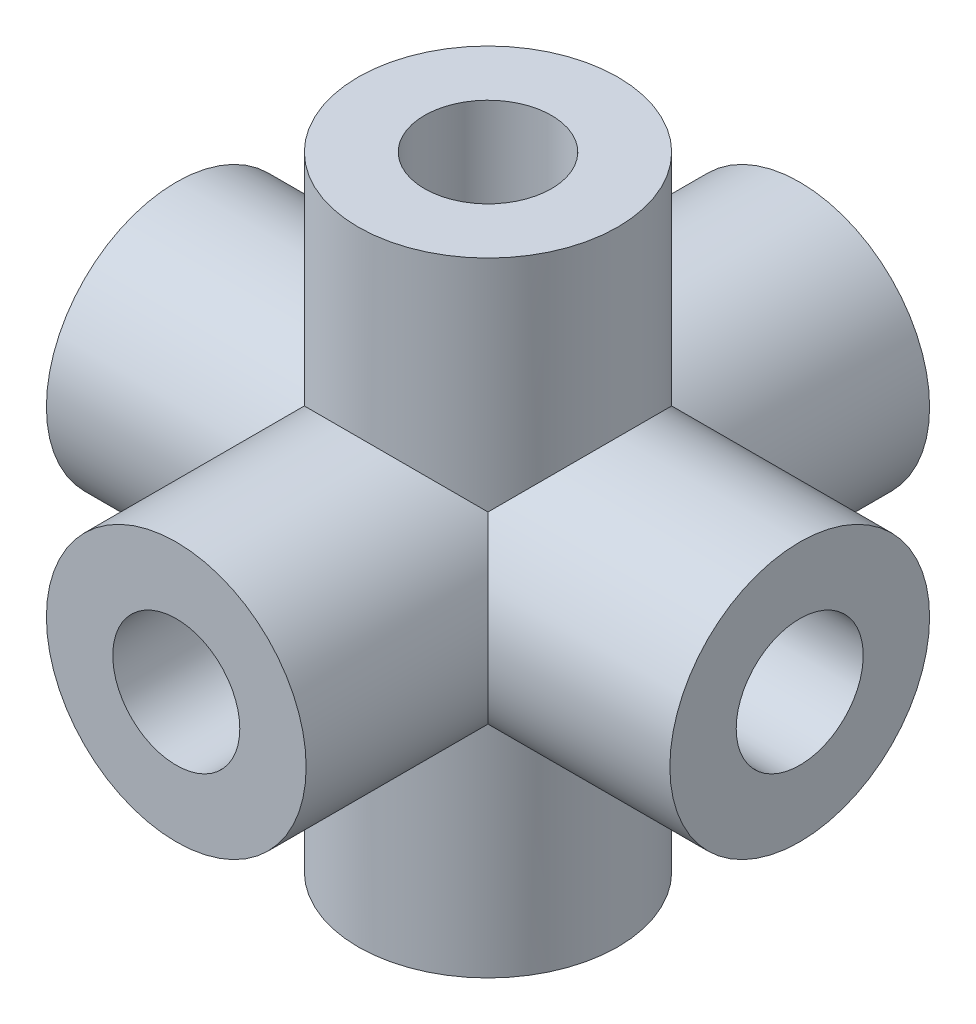
ISO-10303-21;
HEADER;
FILE_DESCRIPTION(('STEP AP214'),'2;1');
FILE_NAME('part.step','',(''),(''),'','','');
FILE_SCHEMA(('AUTOMOTIVE_DESIGN { 1 0 10303 214 1 1 1 1 }'));
ENDSEC;
DATA;
#1=APPLICATION_CONTEXT('core data for automotive mechanical design processes');
#2=APPLICATION_PROTOCOL_DEFINITION('international standard','automotive_design',2000,#1);
#3=PRODUCT_CONTEXT('',#1,'mechanical');
#4=PRODUCT('Part','Part','',(#3));
#5=PRODUCT_RELATED_PRODUCT_CATEGORY('part','',(#4));
#6=PRODUCT_DEFINITION_FORMATION('','',#4);
#7=PRODUCT_DEFINITION_CONTEXT('part definition',#1,'design');
#8=PRODUCT_DEFINITION('design','',#6,#7);
#9=PRODUCT_DEFINITION_SHAPE('','',#8);
#10=(LENGTH_UNIT() NAMED_UNIT(*) SI_UNIT(.MILLI.,.METRE.));
#11=(NAMED_UNIT(*) PLANE_ANGLE_UNIT() SI_UNIT($,.RADIAN.));
#12=(NAMED_UNIT(*) SI_UNIT($,.STERADIAN.) SOLID_ANGLE_UNIT());
#13=UNCERTAINTY_MEASURE_WITH_UNIT(LENGTH_MEASURE(1.E-05),#10,'distance_accuracy_value','');
#14=(GEOMETRIC_REPRESENTATION_CONTEXT(3) GLOBAL_UNCERTAINTY_ASSIGNED_CONTEXT((#13)) GLOBAL_UNIT_ASSIGNED_CONTEXT((#10,
#11,#12)) REPRESENTATION_CONTEXT('',''));
#15=CARTESIAN_POINT('',(0.,0.,0.));
#16=DIRECTION('',(0.,0.,1.));
#17=DIRECTION('',(1.,0.,0.));
#18=AXIS2_PLACEMENT_3D('',#15,#16,#17);
#19=CARTESIAN_POINT('',(0.,-12.,0.));
#20=DIRECTION('',(0.,1.,0.));
#21=DIRECTION('',(0.,0.,1.));
#22=AXIS2_PLACEMENT_3D('',#19,#20,#21);
#23=PLANE('',#22);
#24=CARTESIAN_POINT('',(0.,-12.,0.));
#25=DIRECTION('',(0.,1.,0.));
#26=DIRECTION('',(0.,0.,1.));
#27=AXIS2_PLACEMENT_3D('',#24,#25,#26);
#28=CIRCLE('',#27,5.);
#29=CARTESIAN_POINT('',(0.,-12.,5.));
#30=VERTEX_POINT('',#29);
#31=EDGE_CURVE('E101',#30,#30,#28,.T.);
#32=ORIENTED_EDGE('',*,*,#31,.F.);
#33=EDGE_LOOP('',(#32));
#34=FACE_BOUND('',#33,.T.);
#35=CARTESIAN_POINT('',(0.,-12.,0.));
#36=DIRECTION('',(0.,1.,0.));
#37=DIRECTION('',(0.,0.,1.));
#38=AXIS2_PLACEMENT_3D('',#35,#36,#37);
#39=CIRCLE('',#38,2.445);
#40=CARTESIAN_POINT('',(0.,-12.,2.445));
#41=VERTEX_POINT('',#40);
#42=EDGE_CURVE('E151',#41,#41,#39,.T.);
#43=ORIENTED_EDGE('',*,*,#42,.T.);
#44=EDGE_LOOP('',(#43));
#45=FACE_BOUND('',#44,.T.);
#46=ADVANCED_FACE('F32',(#34,#45),#23,.F.);
#47=CARTESIAN_POINT('',(0.,0.,-12.));
#48=DIRECTION('',(0.,0.,1.));
#49=DIRECTION('',(1.,0.,0.));
#50=AXIS2_PLACEMENT_3D('',#47,#48,#49);
#51=PLANE('',#50);
#52=CARTESIAN_POINT('',(0.,0.,-12.));
#53=DIRECTION('',(0.,0.,1.));
#54=DIRECTION('',(1.,0.,0.));
#55=AXIS2_PLACEMENT_3D('',#52,#53,#54);
#56=CIRCLE('',#55,5.);
#57=CARTESIAN_POINT('',(5.,0.,-12.));
#58=VERTEX_POINT('',#57);
#59=EDGE_CURVE('E95',#58,#58,#56,.T.);
#60=ORIENTED_EDGE('',*,*,#59,.F.);
#61=EDGE_LOOP('',(#60));
#62=FACE_BOUND('',#61,.T.);
#63=CARTESIAN_POINT('',(0.,0.,-12.));
#64=DIRECTION('',(0.,0.,1.));
#65=DIRECTION('',(1.,0.,0.));
#66=AXIS2_PLACEMENT_3D('',#63,#64,#65);
#67=CIRCLE('',#66,2.445);
#68=CARTESIAN_POINT('',(2.445,0.,-12.));
#69=VERTEX_POINT('',#68);
#70=EDGE_CURVE('E139',#69,#69,#67,.T.);
#71=ORIENTED_EDGE('',*,*,#70,.T.);
#72=EDGE_LOOP('',(#71));
#73=FACE_BOUND('',#72,.T.);
#74=ADVANCED_FACE('F169',(#62,#73),#51,.F.);
#75=CARTESIAN_POINT('',(12.,0.,0.));
#76=DIRECTION('',(1.,0.,0.));
#77=DIRECTION('',(0.,0.,-1.));
#78=AXIS2_PLACEMENT_3D('',#75,#76,#77);
#79=PLANE('',#78);
#80=CARTESIAN_POINT('',(12.,0.,0.));
#81=DIRECTION('',(1.,0.,0.));
#82=DIRECTION('',(0.,0.,-1.));
#83=AXIS2_PLACEMENT_3D('',#80,#81,#82);
#84=CIRCLE('',#83,5.);
#85=CARTESIAN_POINT('',(12.,0.,-5.));
#86=VERTEX_POINT('',#85);
#87=EDGE_CURVE('E114',#86,#86,#84,.T.);
#88=ORIENTED_EDGE('',*,*,#87,.T.);
#89=EDGE_LOOP('',(#88));
#90=FACE_BOUND('',#89,.T.);
#91=CARTESIAN_POINT('',(12.,0.,0.));
#92=DIRECTION('',(-1.,0.,0.));
#93=DIRECTION('',(0.,0.,1.));
#94=AXIS2_PLACEMENT_3D('',#91,#92,#93);
#95=CIRCLE('',#94,2.445);
#96=CARTESIAN_POINT('',(12.,0.,2.445));
#97=VERTEX_POINT('',#96);
#98=EDGE_CURVE('E127',#97,#97,#95,.T.);
#99=ORIENTED_EDGE('',*,*,#98,.T.);
#100=EDGE_LOOP('',(#99));
#101=FACE_BOUND('',#100,.T.);
#102=ADVANCED_FACE('F175',(#90,#101),#79,.T.);
#103=CARTESIAN_POINT('',(0.,0.,12.));
#104=DIRECTION('',(0.,0.,-1.));
#105=DIRECTION('',(-1.,0.,0.));
#106=AXIS2_PLACEMENT_3D('',#103,#104,#105);
#107=CYLINDRICAL_SURFACE('',#106,5.);
#108=CARTESIAN_POINT('',(0.,0.,12.));
#109=DIRECTION('',(0.,0.,1.));
#110=DIRECTION('',(1.,0.,0.));
#111=AXIS2_PLACEMENT_3D('',#108,#109,#110);
#112=CIRCLE('',#111,5.);
#113=CARTESIAN_POINT('',(5.,0.,12.));
#114=VERTEX_POINT('',#113);
#115=EDGE_CURVE('E94',#114,#114,#112,.T.);
#116=ORIENTED_EDGE('',*,*,#115,.F.);
#117=EDGE_LOOP('',(#116));
#118=FACE_BOUND('',#117,.T.);
#119=CARTESIAN_POINT('',(0.,0.,0.));
#120=DIRECTION('',(-0.707106781186547,0.,-0.707106781186547));
#121=DIRECTION('',(0.707106781186547,0.,-0.707106781186547));
#122=AXIS2_PLACEMENT_3D('',#119,#120,#121);
#123=ELLIPSE('',#122,7.07106781186547,5.);
#124=CARTESIAN_POINT('',(-3.53553390593274,-3.53553390593274,3.53553390593274));
#125=VERTEX_POINT('',#124);
#126=CARTESIAN_POINT('',(-3.53553390593274,3.53553390593274,3.53553390593274));
#127=VERTEX_POINT('',#126);
#128=EDGE_CURVE('E47',#125,#127,#123,.T.);
#129=ORIENTED_EDGE('',*,*,#128,.F.);
#130=CARTESIAN_POINT('',(0.,0.,0.));
#131=DIRECTION('',(0.,-0.707106781186547,-0.707106781186547));
#132=DIRECTION('',(0.,0.707106781186547,-0.707106781186547));
#133=AXIS2_PLACEMENT_3D('',#130,#131,#132);
#134=ELLIPSE('',#133,7.07106781186547,5.);
#135=CARTESIAN_POINT('',(3.53553390593274,-3.53553390593274,3.53553390593274));
#136=VERTEX_POINT('',#135);
#137=EDGE_CURVE('E78',#136,#125,#134,.T.);
#138=ORIENTED_EDGE('',*,*,#137,.F.);
#139=CARTESIAN_POINT('',(0.,0.,0.));
#140=DIRECTION('',(0.707106781186547,0.,-0.707106781186547));
#141=DIRECTION('',(-0.707106781186547,0.,-0.707106781186547));
#142=AXIS2_PLACEMENT_3D('',#139,#140,#141);
#143=ELLIPSE('',#142,7.07106781186547,5.);
#144=CARTESIAN_POINT('',(3.53553390593274,3.53553390593274,3.53553390593274));
#145=VERTEX_POINT('',#144);
#146=EDGE_CURVE('E82',#145,#136,#143,.T.);
#147=ORIENTED_EDGE('',*,*,#146,.F.);
#148=CARTESIAN_POINT('',(0.,0.,0.));
#149=DIRECTION('',(0.,0.707106781186547,-0.707106781186547));
#150=DIRECTION('',(0.,-0.707106781186547,-0.707106781186547));
#151=AXIS2_PLACEMENT_3D('',#148,#149,#150);
#152=ELLIPSE('',#151,7.07106781186547,5.);
#153=EDGE_CURVE('E73',#127,#145,#152,.T.);
#154=ORIENTED_EDGE('',*,*,#153,.F.);
#155=EDGE_LOOP('',(#129,#138,#147,#154));
#156=FACE_BOUND('',#155,.T.);
#157=ADVANCED_FACE('F34',(#118,#156),#107,.T.);
#158=CARTESIAN_POINT('',(0.,12.,0.));
#159=DIRECTION('',(0.,-1.,0.));
#160=DIRECTION('',(0.,0.,-1.));
#161=AXIS2_PLACEMENT_3D('',#158,#159,#160);
#162=CYLINDRICAL_SURFACE('',#161,5.);
#163=ORIENTED_EDGE('',*,*,#31,.T.);
#164=EDGE_LOOP('',(#163));
#165=FACE_BOUND('',#164,.T.);
#166=CARTESIAN_POINT('',(0.,0.,0.));
#167=DIRECTION('',(-0.707106781186547,-0.707106781186547,0.));
#168=DIRECTION('',(0.707106781186547,-0.707106781186547,0.));
#169=AXIS2_PLACEMENT_3D('',#166,#167,#168);
#170=ELLIPSE('',#169,7.07106781186547,5.);
#171=CARTESIAN_POINT('',(3.53553390593274,-3.53553390593274,-3.53553390593274));
#172=VERTEX_POINT('',#171);
#173=EDGE_CURVE('E54',#136,#172,#170,.F.);
#174=ORIENTED_EDGE('',*,*,#173,.F.);
#175=ORIENTED_EDGE('',*,*,#137,.T.);
#176=CARTESIAN_POINT('',(0.,0.,0.));
#177=DIRECTION('',(0.707106781186547,-0.707106781186547,0.));
#178=DIRECTION('',(-0.707106781186547,-0.707106781186547,0.));
#179=AXIS2_PLACEMENT_3D('',#176,#177,#178);
#180=ELLIPSE('',#179,7.07106781186547,5.);
#181=CARTESIAN_POINT('',(-3.53553390593274,-3.53553390593274,-3.53553390593274));
#182=VERTEX_POINT('',#181);
#183=EDGE_CURVE('E107',#182,#125,#180,.F.);
#184=ORIENTED_EDGE('',*,*,#183,.F.);
#185=CARTESIAN_POINT('',(0.,0.,0.));
#186=DIRECTION('',(0.,0.707106781186547,-0.707106781186547));
#187=DIRECTION('',(0.,-0.707106781186547,-0.707106781186547));
#188=AXIS2_PLACEMENT_3D('',#185,#186,#187);
#189=ELLIPSE('',#188,7.07106781186547,5.);
#190=EDGE_CURVE('E79',#182,#172,#189,.F.);
#191=ORIENTED_EDGE('',*,*,#190,.T.);
#192=EDGE_LOOP('',(#174,#175,#184,#191));
#193=FACE_BOUND('',#192,.T.);
#194=ADVANCED_FACE('F183',(#165,#193),#162,.T.);
#195=ORIENTED_EDGE('',*,*,#59,.T.);
#196=EDGE_LOOP('',(#195));
#197=FACE_BOUND('',#196,.T.);
#198=CARTESIAN_POINT('',(0.,0.,0.));
#199=DIRECTION('',(-0.707106781186547,0.,-0.707106781186547));
#200=DIRECTION('',(0.707106781186547,0.,-0.707106781186547));
#201=AXIS2_PLACEMENT_3D('',#198,#199,#200);
#202=ELLIPSE('',#201,7.07106781186547,5.);
#203=CARTESIAN_POINT('',(3.53553390593274,3.53553390593274,-3.53553390593274));
#204=VERTEX_POINT('',#203);
#205=EDGE_CURVE('E88',#172,#204,#202,.F.);
#206=ORIENTED_EDGE('',*,*,#205,.F.);
#207=ORIENTED_EDGE('',*,*,#190,.F.);
#208=CARTESIAN_POINT('',(0.,0.,0.));
#209=DIRECTION('',(0.707106781186547,0.,-0.707106781186547));
#210=DIRECTION('',(-0.707106781186547,0.,-0.707106781186547));
#211=AXIS2_PLACEMENT_3D('',#208,#209,#210);
#212=ELLIPSE('',#211,7.07106781186547,5.);
#213=CARTESIAN_POINT('',(-3.53553390593274,3.53553390593274,-3.53553390593274));
#214=VERTEX_POINT('',#213);
#215=EDGE_CURVE('E84',#214,#182,#212,.F.);
#216=ORIENTED_EDGE('',*,*,#215,.F.);
#217=CARTESIAN_POINT('',(0.,0.,0.));
#218=DIRECTION('',(0.,-0.707106781186547,-0.707106781186547));
#219=DIRECTION('',(0.,0.707106781186547,-0.707106781186547));
#220=AXIS2_PLACEMENT_3D('',#217,#218,#219);
#221=ELLIPSE('',#220,7.07106781186547,5.);
#222=EDGE_CURVE('E89',#204,#214,#221,.F.);
#223=ORIENTED_EDGE('',*,*,#222,.F.);
#224=EDGE_LOOP('',(#206,#207,#216,#223));
#225=FACE_BOUND('',#224,.T.);
#226=ADVANCED_FACE('F186',(#197,#225),#107,.T.);
#227=CARTESIAN_POINT('',(0.,12.,0.));
#228=DIRECTION('',(0.,1.,0.));
#229=DIRECTION('',(0.,0.,1.));
#230=AXIS2_PLACEMENT_3D('',#227,#228,#229);
#231=CIRCLE('',#230,5.);
#232=CARTESIAN_POINT('',(0.,12.,5.));
#233=VERTEX_POINT('',#232);
#234=EDGE_CURVE('E98',#233,#233,#231,.T.);
#235=ORIENTED_EDGE('',*,*,#234,.F.);
#236=EDGE_LOOP('',(#235));
#237=FACE_BOUND('',#236,.T.);
#238=CARTESIAN_POINT('',(0.,0.,0.));
#239=DIRECTION('',(-0.707106781186547,-0.707106781186547,0.));
#240=DIRECTION('',(0.707106781186547,-0.707106781186547,0.));
#241=AXIS2_PLACEMENT_3D('',#238,#239,#240);
#242=ELLIPSE('',#241,7.07106781186547,5.);
#243=EDGE_CURVE('E11',#127,#214,#242,.T.);
#244=ORIENTED_EDGE('',*,*,#243,.F.);
#245=ORIENTED_EDGE('',*,*,#153,.T.);
#246=CARTESIAN_POINT('',(0.,0.,0.));
#247=DIRECTION('',(0.707106781186547,-0.707106781186547,0.));
#248=DIRECTION('',(-0.707106781186547,-0.707106781186547,0.));
#249=AXIS2_PLACEMENT_3D('',#246,#247,#248);
#250=ELLIPSE('',#249,7.07106781186547,5.);
#251=EDGE_CURVE('E40',#204,#145,#250,.T.);
#252=ORIENTED_EDGE('',*,*,#251,.F.);
#253=ORIENTED_EDGE('',*,*,#222,.T.);
#254=EDGE_LOOP('',(#244,#245,#252,#253));
#255=FACE_BOUND('',#254,.T.);
#256=ADVANCED_FACE('F75',(#237,#255),#162,.T.);
#257=CARTESIAN_POINT('',(0.,0.,12.));
#258=DIRECTION('',(0.,0.,1.));
#259=DIRECTION('',(1.,0.,0.));
#260=AXIS2_PLACEMENT_3D('',#257,#258,#259);
#261=PLANE('',#260);
#262=CARTESIAN_POINT('',(0.,0.,12.));
#263=DIRECTION('',(0.,0.,1.));
#264=DIRECTION('',(1.,0.,0.));
#265=AXIS2_PLACEMENT_3D('',#262,#263,#264);
#266=CIRCLE('',#265,2.445);
#267=CARTESIAN_POINT('',(2.445,0.,12.));
#268=VERTEX_POINT('',#267);
#269=EDGE_CURVE('E133',#268,#268,#266,.T.);
#270=ORIENTED_EDGE('',*,*,#269,.F.);
#271=EDGE_LOOP('',(#270));
#272=FACE_BOUND('',#271,.T.);
#273=ORIENTED_EDGE('',*,*,#115,.T.);
#274=EDGE_LOOP('',(#273));
#275=FACE_BOUND('',#274,.T.);
#276=ADVANCED_FACE('F188',(#272,#275),#261,.T.);
#277=CARTESIAN_POINT('',(0.,12.,0.));
#278=DIRECTION('',(0.,1.,0.));
#279=DIRECTION('',(0.,0.,1.));
#280=AXIS2_PLACEMENT_3D('',#277,#278,#279);
#281=PLANE('',#280);
#282=CARTESIAN_POINT('',(0.,12.,0.));
#283=DIRECTION('',(0.,1.,0.));
#284=DIRECTION('',(0.,0.,1.));
#285=AXIS2_PLACEMENT_3D('',#282,#283,#284);
#286=CIRCLE('',#285,2.445);
#287=CARTESIAN_POINT('',(0.,12.,2.445));
#288=VERTEX_POINT('',#287);
#289=EDGE_CURVE('E145',#288,#288,#286,.T.);
#290=ORIENTED_EDGE('',*,*,#289,.F.);
#291=EDGE_LOOP('',(#290));
#292=FACE_BOUND('',#291,.T.);
#293=ORIENTED_EDGE('',*,*,#234,.T.);
#294=EDGE_LOOP('',(#293));
#295=FACE_BOUND('',#294,.T.);
#296=ADVANCED_FACE('F181',(#292,#295),#281,.T.);
#297=CARTESIAN_POINT('',(12.,0.,0.));
#298=DIRECTION('',(-1.,0.,0.));
#299=DIRECTION('',(0.,0.,1.));
#300=AXIS2_PLACEMENT_3D('',#297,#298,#299);
#301=CYLINDRICAL_SURFACE('',#300,5.);
#302=ORIENTED_EDGE('',*,*,#87,.F.);
#303=EDGE_LOOP('',(#302));
#304=FACE_BOUND('',#303,.T.);
#305=ORIENTED_EDGE('',*,*,#251,.T.);
#306=ORIENTED_EDGE('',*,*,#146,.T.);
#307=ORIENTED_EDGE('',*,*,#173,.T.);
#308=ORIENTED_EDGE('',*,*,#205,.T.);
#309=EDGE_LOOP('',(#305,#306,#307,#308));
#310=FACE_BOUND('',#309,.T.);
#311=ADVANCED_FACE('F87',(#304,#310),#301,.T.);
#312=CARTESIAN_POINT('',(-12.,0.,0.));
#313=DIRECTION('',(1.,0.,0.));
#314=DIRECTION('',(0.,0.,-1.));
#315=AXIS2_PLACEMENT_3D('',#312,#313,#314);
#316=CIRCLE('',#315,5.);
#317=CARTESIAN_POINT('',(-12.,0.,-5.));
#318=VERTEX_POINT('',#317);
#319=EDGE_CURVE('E115',#318,#318,#316,.T.);
#320=ORIENTED_EDGE('',*,*,#319,.T.);
#321=EDGE_LOOP('',(#320));
#322=FACE_BOUND('',#321,.T.);
#323=ORIENTED_EDGE('',*,*,#183,.T.);
#324=ORIENTED_EDGE('',*,*,#128,.T.);
#325=ORIENTED_EDGE('',*,*,#243,.T.);
#326=ORIENTED_EDGE('',*,*,#215,.T.);
#327=EDGE_LOOP('',(#323,#324,#325,#326));
#328=FACE_BOUND('',#327,.T.);
#329=ADVANCED_FACE('F216',(#322,#328),#301,.T.);
#330=CARTESIAN_POINT('',(-12.,0.,0.));
#331=DIRECTION('',(1.,0.,0.));
#332=DIRECTION('',(0.,0.,-1.));
#333=AXIS2_PLACEMENT_3D('',#330,#331,#332);
#334=PLANE('',#333);
#335=CARTESIAN_POINT('',(-12.,0.,0.));
#336=DIRECTION('',(-1.,0.,0.));
#337=DIRECTION('',(0.,0.,1.));
#338=AXIS2_PLACEMENT_3D('',#335,#336,#337);
#339=CIRCLE('',#338,2.445);
#340=CARTESIAN_POINT('',(-12.,0.,2.445));
#341=VERTEX_POINT('',#340);
#342=EDGE_CURVE('E121',#341,#341,#339,.T.);
#343=ORIENTED_EDGE('',*,*,#342,.F.);
#344=EDGE_LOOP('',(#343));
#345=FACE_BOUND('',#344,.T.);
#346=ORIENTED_EDGE('',*,*,#319,.F.);
#347=EDGE_LOOP('',(#346));
#348=FACE_BOUND('',#347,.T.);
#349=ADVANCED_FACE('F218',(#345,#348),#334,.F.);
#350=CARTESIAN_POINT('',(-6.,0.,0.));
#351=DIRECTION('',(-1.,0.,0.));
#352=DIRECTION('',(0.,0.,1.));
#353=AXIS2_PLACEMENT_3D('',#350,#351,#352);
#354=CYLINDRICAL_SURFACE('',#353,2.445);
#355=CARTESIAN_POINT('',(-6.,0.,0.));
#356=DIRECTION('',(-1.,0.,0.));
#357=DIRECTION('',(0.,0.,1.));
#358=AXIS2_PLACEMENT_3D('',#355,#356,#357);
#359=CIRCLE('',#358,2.445);
#360=CARTESIAN_POINT('',(-6.,0.,2.445));
#361=VERTEX_POINT('',#360);
#362=EDGE_CURVE('E118',#361,#361,#359,.T.);
#363=ORIENTED_EDGE('',*,*,#362,.F.);
#364=EDGE_LOOP('',(#363));
#365=FACE_BOUND('',#364,.T.);
#366=ORIENTED_EDGE('',*,*,#342,.T.);
#367=EDGE_LOOP('',(#366));
#368=FACE_BOUND('',#367,.T.);
#369=ADVANCED_FACE('F224',(#365,#368),#354,.F.);
#370=CARTESIAN_POINT('',(-6.,0.,0.));
#371=DIRECTION('',(-1.,0.,0.));
#372=DIRECTION('',(0.,0.,1.));
#373=AXIS2_PLACEMENT_3D('',#370,#371,#372);
#374=PLANE('',#373);
#375=ORIENTED_EDGE('',*,*,#362,.T.);
#376=EDGE_LOOP('',(#375));
#377=FACE_BOUND('',#376,.T.);
#378=ADVANCED_FACE('F231',(#377),#374,.T.);
#379=CARTESIAN_POINT('',(6.,0.,0.));
#380=DIRECTION('',(1.,0.,0.));
#381=DIRECTION('',(0.,0.,-1.));
#382=AXIS2_PLACEMENT_3D('',#379,#380,#381);
#383=CYLINDRICAL_SURFACE('',#382,2.445);
#384=CARTESIAN_POINT('',(6.,0.,0.));
#385=DIRECTION('',(-1.,0.,0.));
#386=DIRECTION('',(0.,0.,1.));
#387=AXIS2_PLACEMENT_3D('',#384,#385,#386);
#388=CIRCLE('',#387,2.445);
#389=CARTESIAN_POINT('',(6.,0.,2.445));
#390=VERTEX_POINT('',#389);
#391=EDGE_CURVE('E124',#390,#390,#388,.T.);
#392=ORIENTED_EDGE('',*,*,#391,.T.);
#393=EDGE_LOOP('',(#392));
#394=FACE_BOUND('',#393,.T.);
#395=ORIENTED_EDGE('',*,*,#98,.F.);
#396=EDGE_LOOP('',(#395));
#397=FACE_BOUND('',#396,.T.);
#398=ADVANCED_FACE('F235',(#394,#397),#383,.F.);
#399=CARTESIAN_POINT('',(6.,0.,0.));
#400=DIRECTION('',(1.,0.,0.));
#401=DIRECTION('',(0.,0.,1.));
#402=AXIS2_PLACEMENT_3D('',#399,#400,#401);
#403=PLANE('',#402);
#404=ORIENTED_EDGE('',*,*,#391,.F.);
#405=EDGE_LOOP('',(#404));
#406=FACE_BOUND('',#405,.T.);
#407=ADVANCED_FACE('F239',(#406),#403,.T.);
#408=CARTESIAN_POINT('',(0.,0.,6.));
#409=DIRECTION('',(0.,0.,1.));
#410=DIRECTION('',(1.,0.,0.));
#411=AXIS2_PLACEMENT_3D('',#408,#409,#410);
#412=CYLINDRICAL_SURFACE('',#411,2.445);
#413=CARTESIAN_POINT('',(0.,0.,6.));
#414=DIRECTION('',(0.,0.,1.));
#415=DIRECTION('',(1.,0.,0.));
#416=AXIS2_PLACEMENT_3D('',#413,#414,#415);
#417=CIRCLE('',#416,2.445);
#418=CARTESIAN_POINT('',(2.445,0.,6.));
#419=VERTEX_POINT('',#418);
#420=EDGE_CURVE('E130',#419,#419,#417,.T.);
#421=ORIENTED_EDGE('',*,*,#420,.F.);
#422=EDGE_LOOP('',(#421));
#423=FACE_BOUND('',#422,.T.);
#424=ORIENTED_EDGE('',*,*,#269,.T.);
#425=EDGE_LOOP('',(#424));
#426=FACE_BOUND('',#425,.T.);
#427=ADVANCED_FACE('F243',(#423,#426),#412,.F.);
#428=CARTESIAN_POINT('',(0.,0.,6.));
#429=DIRECTION('',(0.,0.,1.));
#430=DIRECTION('',(1.,0.,0.));
#431=AXIS2_PLACEMENT_3D('',#428,#429,#430);
#432=PLANE('',#431);
#433=ORIENTED_EDGE('',*,*,#420,.T.);
#434=EDGE_LOOP('',(#433));
#435=FACE_BOUND('',#434,.T.);
#436=ADVANCED_FACE('F247',(#435),#432,.T.);
#437=CARTESIAN_POINT('',(0.,0.,-6.));
#438=DIRECTION('',(0.,0.,-1.));
#439=DIRECTION('',(-1.,0.,0.));
#440=AXIS2_PLACEMENT_3D('',#437,#438,#439);
#441=CYLINDRICAL_SURFACE('',#440,2.445);
#442=CARTESIAN_POINT('',(0.,0.,-6.));
#443=DIRECTION('',(0.,0.,1.));
#444=DIRECTION('',(1.,0.,0.));
#445=AXIS2_PLACEMENT_3D('',#442,#443,#444);
#446=CIRCLE('',#445,2.445);
#447=CARTESIAN_POINT('',(2.445,0.,-6.));
#448=VERTEX_POINT('',#447);
#449=EDGE_CURVE('E136',#448,#448,#446,.T.);
#450=ORIENTED_EDGE('',*,*,#449,.T.);
#451=EDGE_LOOP('',(#450));
#452=FACE_BOUND('',#451,.T.);
#453=ORIENTED_EDGE('',*,*,#70,.F.);
#454=EDGE_LOOP('',(#453));
#455=FACE_BOUND('',#454,.T.);
#456=ADVANCED_FACE('F251',(#452,#455),#441,.F.);
#457=CARTESIAN_POINT('',(0.,0.,-6.));
#458=DIRECTION('',(0.,0.,-1.));
#459=DIRECTION('',(1.,0.,0.));
#460=AXIS2_PLACEMENT_3D('',#457,#458,#459);
#461=PLANE('',#460);
#462=ORIENTED_EDGE('',*,*,#449,.F.);
#463=EDGE_LOOP('',(#462));
#464=FACE_BOUND('',#463,.T.);
#465=ADVANCED_FACE('F255',(#464),#461,.T.);
#466=CARTESIAN_POINT('',(0.,6.,0.));
#467=DIRECTION('',(0.,1.,0.));
#468=DIRECTION('',(0.,0.,1.));
#469=AXIS2_PLACEMENT_3D('',#466,#467,#468);
#470=CYLINDRICAL_SURFACE('',#469,2.445);
#471=CARTESIAN_POINT('',(0.,6.,0.));
#472=DIRECTION('',(0.,1.,0.));
#473=DIRECTION('',(0.,0.,1.));
#474=AXIS2_PLACEMENT_3D('',#471,#472,#473);
#475=CIRCLE('',#474,2.445);
#476=CARTESIAN_POINT('',(0.,6.,2.445));
#477=VERTEX_POINT('',#476);
#478=EDGE_CURVE('E142',#477,#477,#475,.T.);
#479=ORIENTED_EDGE('',*,*,#478,.F.);
#480=EDGE_LOOP('',(#479));
#481=FACE_BOUND('',#480,.T.);
#482=ORIENTED_EDGE('',*,*,#289,.T.);
#483=EDGE_LOOP('',(#482));
#484=FACE_BOUND('',#483,.T.);
#485=ADVANCED_FACE('F259',(#481,#484),#470,.F.);
#486=CARTESIAN_POINT('',(0.,6.,0.));
#487=DIRECTION('',(0.,1.,0.));
#488=DIRECTION('',(0.,0.,1.));
#489=AXIS2_PLACEMENT_3D('',#486,#487,#488);
#490=PLANE('',#489);
#491=ORIENTED_EDGE('',*,*,#478,.T.);
#492=EDGE_LOOP('',(#491));
#493=FACE_BOUND('',#492,.T.);
#494=ADVANCED_FACE('F166',(#493),#490,.T.);
#495=CARTESIAN_POINT('',(0.,-6.,0.));
#496=DIRECTION('',(0.,-1.,0.));
#497=DIRECTION('',(0.,0.,-1.));
#498=AXIS2_PLACEMENT_3D('',#495,#496,#497);
#499=CYLINDRICAL_SURFACE('',#498,2.445);
#500=CARTESIAN_POINT('',(0.,-6.,0.));
#501=DIRECTION('',(0.,1.,0.));
#502=DIRECTION('',(0.,0.,1.));
#503=AXIS2_PLACEMENT_3D('',#500,#501,#502);
#504=CIRCLE('',#503,2.445);
#505=CARTESIAN_POINT('',(0.,-6.,2.445));
#506=VERTEX_POINT('',#505);
#507=EDGE_CURVE('E148',#506,#506,#504,.T.);
#508=ORIENTED_EDGE('',*,*,#507,.T.);
#509=EDGE_LOOP('',(#508));
#510=FACE_BOUND('',#509,.T.);
#511=ORIENTED_EDGE('',*,*,#42,.F.);
#512=EDGE_LOOP('',(#511));
#513=FACE_BOUND('',#512,.T.);
#514=ADVANCED_FACE('F157',(#510,#513),#499,.F.);
#515=CARTESIAN_POINT('',(0.,-6.,0.));
#516=DIRECTION('',(0.,-1.,0.));
#517=DIRECTION('',(0.,0.,1.));
#518=AXIS2_PLACEMENT_3D('',#515,#516,#517);
#519=PLANE('',#518);
#520=ORIENTED_EDGE('',*,*,#507,.F.);
#521=EDGE_LOOP('',(#520));
#522=FACE_BOUND('',#521,.T.);
#523=ADVANCED_FACE('F160',(#522),#519,.T.);
#524=CLOSED_SHELL('',(#46,#74,#102,#157,#194,#226,#256,#276,#296,#311,#329,#349,#369,#378,#398,
#407,#427,#436,#456,#465,#485,#494,#514,#523));
#525=MANIFOLD_SOLID_BREP('B2',#524);
#526=ADVANCED_BREP_SHAPE_REPRESENTATION('',(#18,#525),#14);
#527=SHAPE_DEFINITION_REPRESENTATION(#9,#526);
ENDSEC;
END-ISO-10303-21;
